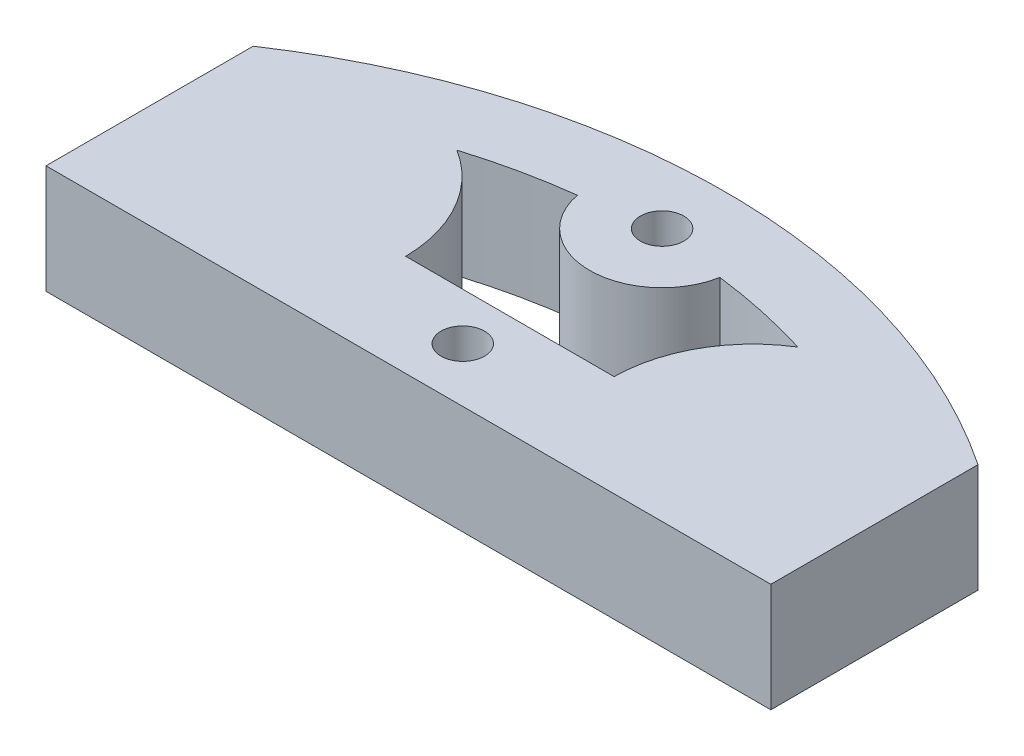
ISO-10303-21;
HEADER;
FILE_DESCRIPTION(('STEP AP214'),'2;1');
FILE_NAME('part.step','',(''),(''),'','','');
FILE_SCHEMA(('AUTOMOTIVE_DESIGN { 1 0 10303 214 1 1 1 1 }'));
ENDSEC;
DATA;
#1=APPLICATION_CONTEXT('core data for automotive mechanical design processes');
#2=APPLICATION_PROTOCOL_DEFINITION('international standard','automotive_design',2000,#1);
#3=PRODUCT_CONTEXT('',#1,'mechanical');
#4=PRODUCT('Part','Part','',(#3));
#5=PRODUCT_RELATED_PRODUCT_CATEGORY('part','',(#4));
#6=PRODUCT_DEFINITION_FORMATION('','',#4);
#7=PRODUCT_DEFINITION_CONTEXT('part definition',#1,'design');
#8=PRODUCT_DEFINITION('design','',#6,#7);
#9=PRODUCT_DEFINITION_SHAPE('','',#8);
#10=(LENGTH_UNIT() NAMED_UNIT(*) SI_UNIT(.MILLI.,.METRE.));
#11=(NAMED_UNIT(*) PLANE_ANGLE_UNIT() SI_UNIT($,.RADIAN.));
#12=(NAMED_UNIT(*) SI_UNIT($,.STERADIAN.) SOLID_ANGLE_UNIT());
#13=UNCERTAINTY_MEASURE_WITH_UNIT(LENGTH_MEASURE(1.E-05),#10,'distance_accuracy_value','');
#14=(GEOMETRIC_REPRESENTATION_CONTEXT(3) GLOBAL_UNCERTAINTY_ASSIGNED_CONTEXT((#13)) GLOBAL_UNIT_ASSIGNED_CONTEXT((#10,
#11,#12)) REPRESENTATION_CONTEXT('',''));
#15=CARTESIAN_POINT('',(0.,0.,0.));
#16=DIRECTION('',(0.,0.,1.));
#17=DIRECTION('',(1.,0.,0.));
#18=AXIS2_PLACEMENT_3D('',#15,#16,#17);
#19=CARTESIAN_POINT('',(16.8544651255317,6.,71.4512867647059));
#20=DIRECTION('',(0.,-1.,0.));
#21=DIRECTION('',(0.,0.,-1.));
#22=AXIS2_PLACEMENT_3D('',#19,#20,#21);
#23=PLANE('',#22);
#24=CARTESIAN_POINT('',(0.,6.,-43.));
#25=DIRECTION('',(0.,1.,0.));
#26=DIRECTION('',(0.,0.,1.));
#27=AXIS2_PLACEMENT_3D('',#24,#25,#26);
#28=CIRCLE('',#27,2.4);
#29=CARTESIAN_POINT('',(0.,6.,-40.6));
#30=VERTEX_POINT('',#29);
#31=EDGE_CURVE('E354',#30,#30,#28,.T.);
#32=ORIENTED_EDGE('',*,*,#31,.F.);
#33=EDGE_LOOP('',(#32));
#34=FACE_BOUND('',#33,.T.);
#35=CARTESIAN_POINT('',(0.,6.,-65.));
#36=DIRECTION('',(0.,1.,0.));
#37=DIRECTION('',(0.,0.,1.));
#38=AXIS2_PLACEMENT_3D('',#35,#36,#37);
#39=CIRCLE('',#38,2.4);
#40=CARTESIAN_POINT('',(0.,6.,-62.6));
#41=VERTEX_POINT('',#40);
#42=EDGE_CURVE('E356',#41,#41,#39,.T.);
#43=ORIENTED_EDGE('',*,*,#42,.F.);
#44=EDGE_LOOP('',(#43));
#45=FACE_BOUND('',#44,.T.);
#46=CARTESIAN_POINT('',(0.,6.,-65.));
#47=DIRECTION('',(0.,-1.,0.));
#48=DIRECTION('',(0.,0.,1.));
#49=AXIS2_PLACEMENT_3D('',#46,#47,#48);
#50=CIRCLE('',#49,7.99999999999992);
#51=CARTESIAN_POINT('',(7.86103791873326,6.,-63.5153846153846));
#52=VERTEX_POINT('',#51);
#53=CARTESIAN_POINT('',(-7.86103791873326,6.,-63.5153846153846));
#54=VERTEX_POINT('',#53);
#55=EDGE_CURVE('E195',#52,#54,#50,.T.);
#56=ORIENTED_EDGE('',*,*,#55,.F.);
#57=CARTESIAN_POINT('',(0.,6.,0.));
#58=DIRECTION('',(0.,1.,0.));
#59=DIRECTION('',(0.,0.,1.));
#60=AXIS2_PLACEMENT_3D('',#57,#58,#59);
#61=CIRCLE('',#60,64.);
#62=CARTESIAN_POINT('',(18.8248909533488,6.,-61.1688113387413));
#63=VERTEX_POINT('',#62);
#64=EDGE_CURVE('E62',#63,#52,#61,.T.);
#65=ORIENTED_EDGE('',*,*,#64,.F.);
#66=CARTESIAN_POINT('',(27.,6.,-48.));
#67=DIRECTION('',(0.,-1.,0.));
#68=DIRECTION('',(0.,0.,1.));
#69=AXIS2_PLACEMENT_3D('',#66,#67,#68);
#70=CIRCLE('',#69,15.5);
#71=CARTESIAN_POINT('',(11.5012903762926,6.,-48.2));
#72=VERTEX_POINT('',#71);
#73=EDGE_CURVE('E167',#72,#63,#70,.T.);
#74=ORIENTED_EDGE('',*,*,#73,.F.);
#75=DIRECTION('',(1.,0.,0.));
#76=VECTOR('',#75,1.);
#77=CARTESIAN_POINT('',(11.5012903762926,6.,-48.2));
#78=LINE('',#77,#76);
#79=CARTESIAN_POINT('',(-11.5012903762926,6.,-48.2));
#80=VERTEX_POINT('',#79);
#81=EDGE_CURVE('E203',#80,#72,#78,.T.);
#82=ORIENTED_EDGE('',*,*,#81,.F.);
#83=CARTESIAN_POINT('',(-27.,6.,-48.));
#84=DIRECTION('',(0.,-1.,0.));
#85=DIRECTION('',(0.,0.,1.));
#86=AXIS2_PLACEMENT_3D('',#83,#84,#85);
#87=CIRCLE('',#86,15.5);
#88=CARTESIAN_POINT('',(-18.8248909533488,6.,-61.1688113387413));
#89=VERTEX_POINT('',#88);
#90=EDGE_CURVE('E206',#89,#80,#87,.T.);
#91=ORIENTED_EDGE('',*,*,#90,.F.);
#92=CARTESIAN_POINT('',(0.,6.,0.));
#93=DIRECTION('',(0.,1.,0.));
#94=DIRECTION('',(0.,0.,1.));
#95=AXIS2_PLACEMENT_3D('',#92,#93,#94);
#96=CIRCLE('',#95,64.);
#97=EDGE_CURVE('E209',#54,#89,#96,.T.);
#98=ORIENTED_EDGE('',*,*,#97,.F.);
#99=EDGE_LOOP('',(#56,#65,#74,#82,#91,#98));
#100=FACE_BOUND('',#99,.T.);
#101=DIRECTION('',(0.,0.,-1.));
#102=VECTOR('',#101,1.);
#103=CARTESIAN_POINT('',(40.,6.,-77.0000000000001));
#104=LINE('',#103,#102);
#105=CARTESIAN_POINT('',(40.,6.,-37.0000000000001));
#106=VERTEX_POINT('',#105);
#107=CARTESIAN_POINT('',(40.,6.,-59.8665181883831));
#108=VERTEX_POINT('',#107);
#109=EDGE_CURVE('E137',#106,#108,#104,.T.);
#110=ORIENTED_EDGE('',*,*,#109,.T.);
#111=CARTESIAN_POINT('',(0.,6.,0.));
#112=DIRECTION('',(0.,1.,0.));
#113=DIRECTION('',(0.,0.,1.));
#114=AXIS2_PLACEMENT_3D('',#111,#112,#113);
#115=CIRCLE('',#114,72.);
#116=CARTESIAN_POINT('',(-40.,6.,-59.8665181883831));
#117=VERTEX_POINT('',#116);
#118=EDGE_CURVE('E149',#108,#117,#115,.T.);
#119=ORIENTED_EDGE('',*,*,#118,.T.);
#120=DIRECTION('',(0.,0.,1.));
#121=VECTOR('',#120,1.);
#122=CARTESIAN_POINT('',(-40.,6.,-77.0000000000001));
#123=LINE('',#122,#121);
#124=CARTESIAN_POINT('',(-40.,6.,-37.0000000000001));
#125=VERTEX_POINT('',#124);
#126=EDGE_CURVE('E54',#117,#125,#123,.T.);
#127=ORIENTED_EDGE('',*,*,#126,.T.);
#128=DIRECTION('',(1.,0.,0.));
#129=VECTOR('',#128,1.);
#130=CARTESIAN_POINT('',(-40.,6.,-37.0000000000001));
#131=LINE('',#130,#129);
#132=EDGE_CURVE('E130',#125,#106,#131,.T.);
#133=ORIENTED_EDGE('',*,*,#132,.T.);
#134=EDGE_LOOP('',(#110,#119,#127,#133));
#135=FACE_BOUND('',#134,.T.);
#136=ADVANCED_FACE('F39',(#34,#45,#100,#135),#23,.F.);
#137=CARTESIAN_POINT('',(16.8544651255317,-6.,71.4512867647059));
#138=DIRECTION('',(0.,-1.,0.));
#139=DIRECTION('',(0.,0.,-1.));
#140=AXIS2_PLACEMENT_3D('',#137,#138,#139);
#141=PLANE('',#140);
#142=CARTESIAN_POINT('',(0.,-6.,-43.));
#143=DIRECTION('',(0.,1.,0.));
#144=DIRECTION('',(0.,0.,1.));
#145=AXIS2_PLACEMENT_3D('',#142,#143,#144);
#146=CIRCLE('',#145,2.4);
#147=CARTESIAN_POINT('',(0.,-6.,-40.6));
#148=VERTEX_POINT('',#147);
#149=EDGE_CURVE('E352',#148,#148,#146,.T.);
#150=ORIENTED_EDGE('',*,*,#149,.T.);
#151=EDGE_LOOP('',(#150));
#152=FACE_BOUND('',#151,.T.);
#153=CARTESIAN_POINT('',(0.,-6.,-65.));
#154=DIRECTION('',(0.,1.,0.));
#155=DIRECTION('',(0.,0.,1.));
#156=AXIS2_PLACEMENT_3D('',#153,#154,#155);
#157=CIRCLE('',#156,2.4);
#158=CARTESIAN_POINT('',(0.,-6.,-62.6));
#159=VERTEX_POINT('',#158);
#160=EDGE_CURVE('E141',#159,#159,#157,.T.);
#161=ORIENTED_EDGE('',*,*,#160,.T.);
#162=EDGE_LOOP('',(#161));
#163=FACE_BOUND('',#162,.T.);
#164=CARTESIAN_POINT('',(0.,-6.,0.));
#165=DIRECTION('',(0.,1.,0.));
#166=DIRECTION('',(0.,0.,1.));
#167=AXIS2_PLACEMENT_3D('',#164,#165,#166);
#168=CIRCLE('',#167,64.);
#169=CARTESIAN_POINT('',(18.8248909533488,-6.,-61.1688113387413));
#170=VERTEX_POINT('',#169);
#171=CARTESIAN_POINT('',(7.86103791873326,-6.,-63.5153846153846));
#172=VERTEX_POINT('',#171);
#173=EDGE_CURVE('E229',#170,#172,#168,.T.);
#174=ORIENTED_EDGE('',*,*,#173,.T.);
#175=CARTESIAN_POINT('',(0.,-6.,-65.));
#176=DIRECTION('',(0.,-1.,0.));
#177=DIRECTION('',(0.,0.,1.));
#178=AXIS2_PLACEMENT_3D('',#175,#176,#177);
#179=CIRCLE('',#178,7.99999999999992);
#180=CARTESIAN_POINT('',(-7.86103791873326,-6.,-63.5153846153846));
#181=VERTEX_POINT('',#180);
#182=EDGE_CURVE('E227',#172,#181,#179,.T.);
#183=ORIENTED_EDGE('',*,*,#182,.T.);
#184=CARTESIAN_POINT('',(0.,-6.,0.));
#185=DIRECTION('',(0.,1.,0.));
#186=DIRECTION('',(0.,0.,1.));
#187=AXIS2_PLACEMENT_3D('',#184,#185,#186);
#188=CIRCLE('',#187,64.);
#189=CARTESIAN_POINT('',(-18.8248909533488,-6.,-61.1688113387413));
#190=VERTEX_POINT('',#189);
#191=EDGE_CURVE('E226',#181,#190,#188,.T.);
#192=ORIENTED_EDGE('',*,*,#191,.T.);
#193=CARTESIAN_POINT('',(-27.,-6.,-48.));
#194=DIRECTION('',(0.,-1.,0.));
#195=DIRECTION('',(0.,0.,1.));
#196=AXIS2_PLACEMENT_3D('',#193,#194,#195);
#197=CIRCLE('',#196,15.5);
#198=CARTESIAN_POINT('',(-11.5012903762926,-6.,-48.2));
#199=VERTEX_POINT('',#198);
#200=EDGE_CURVE('E189',#190,#199,#197,.T.);
#201=ORIENTED_EDGE('',*,*,#200,.T.);
#202=DIRECTION('',(1.,0.,0.));
#203=VECTOR('',#202,1.);
#204=CARTESIAN_POINT('',(11.5012903762926,-6.,-48.2));
#205=LINE('',#204,#203);
#206=CARTESIAN_POINT('',(11.5012903762926,-6.,-48.2));
#207=VERTEX_POINT('',#206);
#208=EDGE_CURVE('E183',#199,#207,#205,.T.);
#209=ORIENTED_EDGE('',*,*,#208,.T.);
#210=CARTESIAN_POINT('',(27.,-6.,-48.));
#211=DIRECTION('',(0.,-1.,0.));
#212=DIRECTION('',(0.,0.,1.));
#213=AXIS2_PLACEMENT_3D('',#210,#211,#212);
#214=CIRCLE('',#213,15.5);
#215=EDGE_CURVE('E178',#207,#170,#214,.T.);
#216=ORIENTED_EDGE('',*,*,#215,.T.);
#217=EDGE_LOOP('',(#174,#183,#192,#201,#209,#216));
#218=FACE_BOUND('',#217,.T.);
#219=CARTESIAN_POINT('',(0.,-6.,0.));
#220=DIRECTION('',(0.,1.,0.));
#221=DIRECTION('',(0.,0.,1.));
#222=AXIS2_PLACEMENT_3D('',#219,#220,#221);
#223=CIRCLE('',#222,72.);
#224=CARTESIAN_POINT('',(40.,-6.,-59.8665181883831));
#225=VERTEX_POINT('',#224);
#226=CARTESIAN_POINT('',(-40.,-6.,-59.8665181883831));
#227=VERTEX_POINT('',#226);
#228=EDGE_CURVE('E154',#225,#227,#223,.T.);
#229=ORIENTED_EDGE('',*,*,#228,.F.);
#230=DIRECTION('',(0.,0.,-1.));
#231=VECTOR('',#230,1.);
#232=CARTESIAN_POINT('',(40.,-6.,-77.0000000000001));
#233=LINE('',#232,#231);
#234=CARTESIAN_POINT('',(40.,-6.,-37.0000000000001));
#235=VERTEX_POINT('',#234);
#236=EDGE_CURVE('E123',#235,#225,#233,.T.);
#237=ORIENTED_EDGE('',*,*,#236,.F.);
#238=DIRECTION('',(1.,0.,0.));
#239=VECTOR('',#238,1.);
#240=CARTESIAN_POINT('',(-40.,-6.,-37.0000000000001));
#241=LINE('',#240,#239);
#242=CARTESIAN_POINT('',(-40.,-6.,-37.0000000000001));
#243=VERTEX_POINT('',#242);
#244=EDGE_CURVE('E122',#243,#235,#241,.T.);
#245=ORIENTED_EDGE('',*,*,#244,.F.);
#246=DIRECTION('',(0.,0.,1.));
#247=VECTOR('',#246,1.);
#248=CARTESIAN_POINT('',(-40.,-6.,-77.0000000000001));
#249=LINE('',#248,#247);
#250=EDGE_CURVE('E113',#227,#243,#249,.T.);
#251=ORIENTED_EDGE('',*,*,#250,.F.);
#252=EDGE_LOOP('',(#229,#237,#245,#251));
#253=FACE_BOUND('',#252,.T.);
#254=ADVANCED_FACE('F133',(#152,#163,#218,#253),#141,.T.);
#255=CARTESIAN_POINT('',(0.,6.,0.));
#256=DIRECTION('',(0.,-1.,0.));
#257=DIRECTION('',(0.,0.,-1.));
#258=AXIS2_PLACEMENT_3D('',#255,#256,#257);
#259=CYLINDRICAL_SURFACE('',#258,72.);
#260=DIRECTION('',(0.,-1.,0.));
#261=VECTOR('',#260,1.);
#262=CARTESIAN_POINT('',(40.,6.,-59.8665181883831));
#263=LINE('',#262,#261);
#264=EDGE_CURVE('E13',#225,#108,#263,.F.);
#265=ORIENTED_EDGE('',*,*,#264,.F.);
#266=ORIENTED_EDGE('',*,*,#228,.T.);
#267=DIRECTION('',(0.,-1.,0.));
#268=VECTOR('',#267,1.);
#269=CARTESIAN_POINT('',(-40.,6.,-59.8665181883831));
#270=LINE('',#269,#268);
#271=EDGE_CURVE('E47',#117,#227,#270,.T.);
#272=ORIENTED_EDGE('',*,*,#271,.F.);
#273=ORIENTED_EDGE('',*,*,#118,.F.);
#274=EDGE_LOOP('',(#265,#266,#272,#273));
#275=FACE_BOUND('',#274,.T.);
#276=ADVANCED_FACE('F41',(#275),#259,.T.);
#277=CARTESIAN_POINT('',(0.,-6.,0.));
#278=DIRECTION('',(0.,1.,0.));
#279=DIRECTION('',(0.,0.,1.));
#280=AXIS2_PLACEMENT_3D('',#277,#278,#279);
#281=CYLINDRICAL_SURFACE('',#280,64.);
#282=ORIENTED_EDGE('',*,*,#64,.T.);
#283=DIRECTION('',(0.,1.,0.));
#284=VECTOR('',#283,1.);
#285=CARTESIAN_POINT('',(7.86103791873326,-6.,-63.5153846153846));
#286=LINE('',#285,#284);
#287=EDGE_CURVE('E155',#172,#52,#286,.T.);
#288=ORIENTED_EDGE('',*,*,#287,.F.);
#289=ORIENTED_EDGE('',*,*,#173,.F.);
#290=DIRECTION('',(0.,1.,0.));
#291=VECTOR('',#290,1.);
#292=CARTESIAN_POINT('',(18.8248909533488,-6.,-61.1688113387413));
#293=LINE('',#292,#291);
#294=EDGE_CURVE('E157',#170,#63,#293,.T.);
#295=ORIENTED_EDGE('',*,*,#294,.T.);
#296=EDGE_LOOP('',(#282,#288,#289,#295));
#297=FACE_BOUND('',#296,.T.);
#298=ADVANCED_FACE('F257',(#297),#281,.F.);
#299=CARTESIAN_POINT('',(27.,-6.,-48.));
#300=DIRECTION('',(0.,1.,0.));
#301=DIRECTION('',(0.,0.,1.));
#302=AXIS2_PLACEMENT_3D('',#299,#300,#301);
#303=CYLINDRICAL_SURFACE('',#302,15.5);
#304=ORIENTED_EDGE('',*,*,#73,.T.);
#305=ORIENTED_EDGE('',*,*,#294,.F.);
#306=ORIENTED_EDGE('',*,*,#215,.F.);
#307=DIRECTION('',(0.,1.,0.));
#308=VECTOR('',#307,1.);
#309=CARTESIAN_POINT('',(11.5012903762926,-6.,-48.2));
#310=LINE('',#309,#308);
#311=EDGE_CURVE('E160',#207,#72,#310,.T.);
#312=ORIENTED_EDGE('',*,*,#311,.T.);
#313=EDGE_LOOP('',(#304,#305,#306,#312));
#314=FACE_BOUND('',#313,.T.);
#315=ADVANCED_FACE('F259',(#314),#303,.T.);
#316=CARTESIAN_POINT('',(11.5012903762926,-6.,-48.2));
#317=DIRECTION('',(0.,0.,1.));
#318=DIRECTION('',(1.,0.,0.));
#319=AXIS2_PLACEMENT_3D('',#316,#317,#318);
#320=PLANE('',#319);
#321=ORIENTED_EDGE('',*,*,#81,.T.);
#322=ORIENTED_EDGE('',*,*,#311,.F.);
#323=ORIENTED_EDGE('',*,*,#208,.F.);
#324=DIRECTION('',(0.,1.,0.));
#325=VECTOR('',#324,1.);
#326=CARTESIAN_POINT('',(-11.5012903762926,-6.,-48.2));
#327=LINE('',#326,#325);
#328=EDGE_CURVE('E164',#199,#80,#327,.T.);
#329=ORIENTED_EDGE('',*,*,#328,.T.);
#330=EDGE_LOOP('',(#321,#322,#323,#329));
#331=FACE_BOUND('',#330,.T.);
#332=ADVANCED_FACE('F265',(#331),#320,.F.);
#333=CARTESIAN_POINT('',(-27.,-6.,-48.));
#334=DIRECTION('',(0.,1.,0.));
#335=DIRECTION('',(0.,0.,1.));
#336=AXIS2_PLACEMENT_3D('',#333,#334,#335);
#337=CYLINDRICAL_SURFACE('',#336,15.5);
#338=ORIENTED_EDGE('',*,*,#90,.T.);
#339=ORIENTED_EDGE('',*,*,#328,.F.);
#340=ORIENTED_EDGE('',*,*,#200,.F.);
#341=DIRECTION('',(0.,1.,0.));
#342=VECTOR('',#341,1.);
#343=CARTESIAN_POINT('',(-18.8248909533488,-6.,-61.1688113387413));
#344=LINE('',#343,#342);
#345=EDGE_CURVE('E172',#190,#89,#344,.T.);
#346=ORIENTED_EDGE('',*,*,#345,.T.);
#347=EDGE_LOOP('',(#338,#339,#340,#346));
#348=FACE_BOUND('',#347,.T.);
#349=ADVANCED_FACE('F220',(#348),#337,.T.);
#350=CARTESIAN_POINT('',(0.,-6.,0.));
#351=DIRECTION('',(0.,1.,0.));
#352=DIRECTION('',(0.,0.,1.));
#353=AXIS2_PLACEMENT_3D('',#350,#351,#352);
#354=CYLINDRICAL_SURFACE('',#353,64.);
#355=ORIENTED_EDGE('',*,*,#97,.T.);
#356=ORIENTED_EDGE('',*,*,#345,.F.);
#357=ORIENTED_EDGE('',*,*,#191,.F.);
#358=DIRECTION('',(0.,1.,0.));
#359=VECTOR('',#358,1.);
#360=CARTESIAN_POINT('',(-7.86103791873326,-6.,-63.5153846153846));
#361=LINE('',#360,#359);
#362=EDGE_CURVE('E173',#181,#54,#361,.T.);
#363=ORIENTED_EDGE('',*,*,#362,.T.);
#364=EDGE_LOOP('',(#355,#356,#357,#363));
#365=FACE_BOUND('',#364,.T.);
#366=ADVANCED_FACE('F225',(#365),#354,.F.);
#367=CARTESIAN_POINT('',(0.,-6.,-65.));
#368=DIRECTION('',(0.,1.,0.));
#369=DIRECTION('',(0.,0.,1.));
#370=AXIS2_PLACEMENT_3D('',#367,#368,#369);
#371=CYLINDRICAL_SURFACE('',#370,7.99999999999992);
#372=ORIENTED_EDGE('',*,*,#55,.T.);
#373=ORIENTED_EDGE('',*,*,#362,.F.);
#374=ORIENTED_EDGE('',*,*,#182,.F.);
#375=ORIENTED_EDGE('',*,*,#287,.T.);
#376=EDGE_LOOP('',(#372,#373,#374,#375));
#377=FACE_BOUND('',#376,.T.);
#378=ADVANCED_FACE('F213',(#377),#371,.T.);
#379=CARTESIAN_POINT('',(40.,-6.,-77.0000000000001));
#380=DIRECTION('',(1.,0.,0.));
#381=DIRECTION('',(0.,0.,-1.));
#382=AXIS2_PLACEMENT_3D('',#379,#380,#381);
#383=PLANE('',#382);
#384=ORIENTED_EDGE('',*,*,#264,.T.);
#385=ORIENTED_EDGE('',*,*,#109,.F.);
#386=DIRECTION('',(0.,1.,0.));
#387=VECTOR('',#386,1.);
#388=CARTESIAN_POINT('',(40.,-6.,-37.0000000000001));
#389=LINE('',#388,#387);
#390=EDGE_CURVE('E131',#235,#106,#389,.T.);
#391=ORIENTED_EDGE('',*,*,#390,.F.);
#392=ORIENTED_EDGE('',*,*,#236,.T.);
#393=EDGE_LOOP('',(#384,#385,#391,#392));
#394=FACE_BOUND('',#393,.T.);
#395=ADVANCED_FACE('F237',(#394),#383,.T.);
#396=CARTESIAN_POINT('',(-40.,-6.,-77.0000000000001));
#397=DIRECTION('',(-1.,0.,0.));
#398=DIRECTION('',(0.,0.,1.));
#399=AXIS2_PLACEMENT_3D('',#396,#397,#398);
#400=PLANE('',#399);
#401=ORIENTED_EDGE('',*,*,#271,.T.);
#402=ORIENTED_EDGE('',*,*,#250,.T.);
#403=DIRECTION('',(0.,1.,0.));
#404=VECTOR('',#403,1.);
#405=CARTESIAN_POINT('',(-40.,-6.,-37.0000000000001));
#406=LINE('',#405,#404);
#407=EDGE_CURVE('E116',#243,#125,#406,.T.);
#408=ORIENTED_EDGE('',*,*,#407,.T.);
#409=ORIENTED_EDGE('',*,*,#126,.F.);
#410=EDGE_LOOP('',(#401,#402,#408,#409));
#411=FACE_BOUND('',#410,.T.);
#412=ADVANCED_FACE('F115',(#411),#400,.T.);
#413=CARTESIAN_POINT('',(-40.,-6.,-37.0000000000001));
#414=DIRECTION('',(0.,0.,1.));
#415=DIRECTION('',(1.,0.,0.));
#416=AXIS2_PLACEMENT_3D('',#413,#414,#415);
#417=PLANE('',#416);
#418=ORIENTED_EDGE('',*,*,#132,.F.);
#419=ORIENTED_EDGE('',*,*,#407,.F.);
#420=ORIENTED_EDGE('',*,*,#244,.T.);
#421=ORIENTED_EDGE('',*,*,#390,.T.);
#422=EDGE_LOOP('',(#418,#419,#420,#421));
#423=FACE_BOUND('',#422,.T.);
#424=ADVANCED_FACE('F127',(#423),#417,.T.);
#425=CARTESIAN_POINT('',(0.,-6.,-65.));
#426=DIRECTION('',(0.,1.,0.));
#427=DIRECTION('',(0.,0.,1.));
#428=AXIS2_PLACEMENT_3D('',#425,#426,#427);
#429=CYLINDRICAL_SURFACE('',#428,2.4);
#430=ORIENTED_EDGE('',*,*,#160,.F.);
#431=EDGE_LOOP('',(#430));
#432=FACE_BOUND('',#431,.T.);
#433=ORIENTED_EDGE('',*,*,#42,.T.);
#434=EDGE_LOOP('',(#433));
#435=FACE_BOUND('',#434,.T.);
#436=ADVANCED_FACE('F317',(#432,#435),#429,.F.);
#437=CARTESIAN_POINT('',(0.,-6.,-43.));
#438=DIRECTION('',(0.,1.,0.));
#439=DIRECTION('',(0.,0.,1.));
#440=AXIS2_PLACEMENT_3D('',#437,#438,#439);
#441=CYLINDRICAL_SURFACE('',#440,2.4);
#442=ORIENTED_EDGE('',*,*,#149,.F.);
#443=EDGE_LOOP('',(#442));
#444=FACE_BOUND('',#443,.T.);
#445=ORIENTED_EDGE('',*,*,#31,.T.);
#446=EDGE_LOOP('',(#445));
#447=FACE_BOUND('',#446,.T.);
#448=ADVANCED_FACE('F335',(#444,#447),#441,.F.);
#449=CLOSED_SHELL('',(#136,#254,#276,#298,#315,#332,#349,#366,#378,#395,#412,#424,#436,#448));
#450=MANIFOLD_SOLID_BREP('B2',#449);
#451=ADVANCED_BREP_SHAPE_REPRESENTATION('',(#18,#450),#14);
#452=SHAPE_DEFINITION_REPRESENTATION(#9,#451);
ENDSEC;
END-ISO-10303-21;
